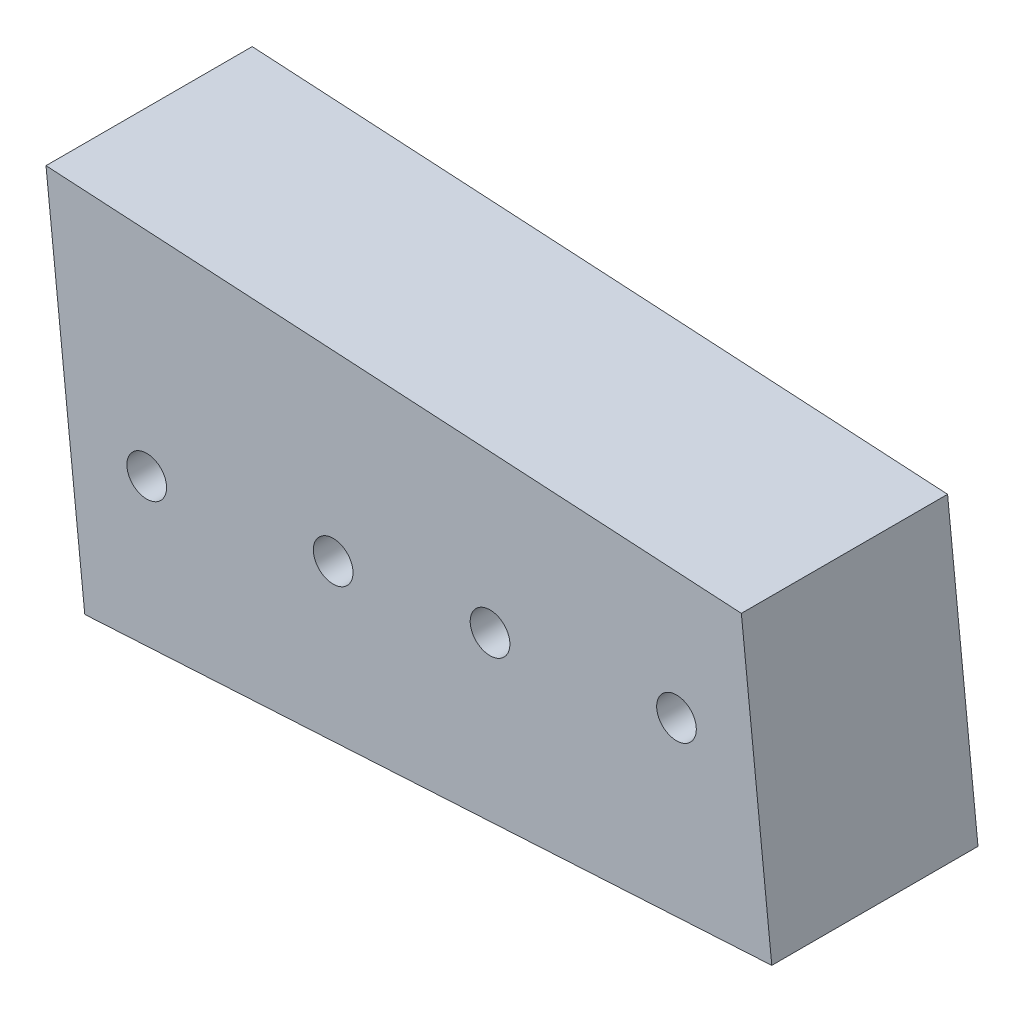
ISO-10303-21;
HEADER;
FILE_DESCRIPTION(('STEP AP214'),'2;1');
FILE_NAME('part.step','',(''),(''),'','','');
FILE_SCHEMA(('AUTOMOTIVE_DESIGN { 1 0 10303 214 1 1 1 1 }'));
ENDSEC;
DATA;
#1=APPLICATION_CONTEXT('core data for automotive mechanical design processes');
#2=APPLICATION_PROTOCOL_DEFINITION('international standard','automotive_design',2000,#1);
#3=PRODUCT_CONTEXT('',#1,'mechanical');
#4=PRODUCT('Part','Part','',(#3));
#5=PRODUCT_RELATED_PRODUCT_CATEGORY('part','',(#4));
#6=PRODUCT_DEFINITION_FORMATION('','',#4);
#7=PRODUCT_DEFINITION_CONTEXT('part definition',#1,'design');
#8=PRODUCT_DEFINITION('design','',#6,#7);
#9=PRODUCT_DEFINITION_SHAPE('','',#8);
#10=(LENGTH_UNIT() NAMED_UNIT(*) SI_UNIT(.MILLI.,.METRE.));
#11=(NAMED_UNIT(*) PLANE_ANGLE_UNIT() SI_UNIT($,.RADIAN.));
#12=(NAMED_UNIT(*) SI_UNIT($,.STERADIAN.) SOLID_ANGLE_UNIT());
#13=UNCERTAINTY_MEASURE_WITH_UNIT(LENGTH_MEASURE(1.E-05),#10,'distance_accuracy_value','');
#14=(GEOMETRIC_REPRESENTATION_CONTEXT(3) GLOBAL_UNCERTAINTY_ASSIGNED_CONTEXT((#13)) GLOBAL_UNIT_ASSIGNED_CONTEXT((#10,
#11,#12)) REPRESENTATION_CONTEXT('',''));
#15=CARTESIAN_POINT('',(0.,0.,0.));
#16=DIRECTION('',(0.,0.,1.));
#17=DIRECTION('',(1.,0.,0.));
#18=AXIS2_PLACEMENT_3D('',#15,#16,#17);
#19=CARTESIAN_POINT('',(73.4186141508776,23.1798241370347,16.5));
#20=DIRECTION('',(-0.99453305601479,-0.104422222222489,0.));
#21=DIRECTION('',(0.104422222222489,-0.99453305601479,0.));
#22=AXIS2_PLACEMENT_3D('',#19,#20,#21);
#23=PLANE('',#22);
#24=DIRECTION('',(-0.104422222222489,0.99453305601479,0.));
#25=VECTOR('',#24,1.);
#26=CARTESIAN_POINT('',(73.4186141508776,23.1798241370347,-16.5));
#27=LINE('',#26,#25);
#28=CARTESIAN_POINT('',(78.2862024778353,-23.1798241370335,-16.5));
#29=VERTEX_POINT('',#28);
#30=CARTESIAN_POINT('',(73.4186141508776,23.1798241370347,-16.5));
#31=VERTEX_POINT('',#30);
#32=EDGE_CURVE('E100',#29,#31,#27,.T.);
#33=ORIENTED_EDGE('',*,*,#32,.T.);
#34=DIRECTION('',(0.,0.,-1.));
#35=VECTOR('',#34,1.);
#36=CARTESIAN_POINT('',(73.4186141508776,23.1798241370347,16.5));
#37=LINE('',#36,#35);
#38=CARTESIAN_POINT('',(73.4186141508776,23.1798241370347,16.5));
#39=VERTEX_POINT('',#38);
#40=EDGE_CURVE('E11',#39,#31,#37,.T.);
#41=ORIENTED_EDGE('',*,*,#40,.F.);
#42=DIRECTION('',(-0.104422222222489,0.99453305601479,0.));
#43=VECTOR('',#42,1.);
#44=CARTESIAN_POINT('',(73.4186141508776,23.1798241370347,16.5));
#45=LINE('',#44,#43);
#46=CARTESIAN_POINT('',(78.2862024778353,-23.1798241370335,16.5));
#47=VERTEX_POINT('',#46);
#48=EDGE_CURVE('E88',#47,#39,#45,.T.);
#49=ORIENTED_EDGE('',*,*,#48,.F.);
#50=DIRECTION('',(0.,0.,-1.));
#51=VECTOR('',#50,1.);
#52=CARTESIAN_POINT('',(78.2862024778353,-23.1798241370335,16.5));
#53=LINE('',#52,#51);
#54=EDGE_CURVE('E96',#47,#29,#53,.T.);
#55=ORIENTED_EDGE('',*,*,#54,.T.);
#56=EDGE_LOOP('',(#33,#41,#49,#55));
#57=FACE_BOUND('',#56,.T.);
#58=ADVANCED_FACE('F37',(#57),#23,.F.);
#59=CARTESIAN_POINT('',(-37.8586436503708,29.5856566483933,16.5));
#60=DIRECTION('',(-0.0574712643678064,-0.998347160947516,0.));
#61=DIRECTION('',(0.998347160947516,-0.0574712643678064,0.));
#62=AXIS2_PLACEMENT_3D('',#59,#60,#61);
#63=PLANE('',#62);
#64=DIRECTION('',(-0.998347160947516,0.0574712643678064,0.));
#65=VECTOR('',#64,1.);
#66=CARTESIAN_POINT('',(-37.8586436503708,29.5856566483933,-16.5));
#67=LINE('',#66,#65);
#68=CARTESIAN_POINT('',(-37.8586436503708,29.5856566483933,-16.5));
#69=VERTEX_POINT('',#68);
#70=EDGE_CURVE('E92',#31,#69,#67,.T.);
#71=ORIENTED_EDGE('',*,*,#70,.T.);
#72=DIRECTION('',(0.,0.,-1.));
#73=VECTOR('',#72,1.);
#74=CARTESIAN_POINT('',(-37.8586436503708,29.5856566483933,16.5));
#75=LINE('',#74,#73);
#76=CARTESIAN_POINT('',(-37.8586436503708,29.5856566483933,16.5));
#77=VERTEX_POINT('',#76);
#78=EDGE_CURVE('E45',#77,#69,#75,.T.);
#79=ORIENTED_EDGE('',*,*,#78,.F.);
#80=DIRECTION('',(-0.998347160947516,0.0574712643678064,0.));
#81=VECTOR('',#80,1.);
#82=CARTESIAN_POINT('',(-37.8586436503708,29.5856566483933,16.5));
#83=LINE('',#82,#81);
#84=EDGE_CURVE('E83',#39,#77,#83,.T.);
#85=ORIENTED_EDGE('',*,*,#84,.F.);
#86=ORIENTED_EDGE('',*,*,#40,.T.);
#87=EDGE_LOOP('',(#71,#79,#85,#86));
#88=FACE_BOUND('',#87,.T.);
#89=ADVANCED_FACE('F91',(#88),#63,.F.);
#90=CARTESIAN_POINT('',(-31.6539605302437,-29.5086848981364,16.5));
#91=DIRECTION('',(0.99453305601479,0.104422222222489,0.));
#92=DIRECTION('',(-0.104422222222489,0.99453305601479,0.));
#93=AXIS2_PLACEMENT_3D('',#90,#91,#92);
#94=PLANE('',#93);
#95=DIRECTION('',(0.104422222222489,-0.99453305601479,0.));
#96=VECTOR('',#95,1.);
#97=CARTESIAN_POINT('',(-31.6539605302437,-29.5086848981364,-16.5));
#98=LINE('',#97,#96);
#99=CARTESIAN_POINT('',(-31.6539605302437,-29.5086848981364,-16.5));
#100=VERTEX_POINT('',#99);
#101=EDGE_CURVE('E70',#69,#100,#98,.T.);
#102=ORIENTED_EDGE('',*,*,#101,.T.);
#103=DIRECTION('',(0.,0.,-1.));
#104=VECTOR('',#103,1.);
#105=CARTESIAN_POINT('',(-31.6539605302437,-29.5086848981364,16.5));
#106=LINE('',#105,#104);
#107=CARTESIAN_POINT('',(-31.6539605302437,-29.5086848981364,16.5));
#108=VERTEX_POINT('',#107);
#109=EDGE_CURVE('E93',#108,#100,#106,.T.);
#110=ORIENTED_EDGE('',*,*,#109,.F.);
#111=DIRECTION('',(0.104422222222489,-0.99453305601479,0.));
#112=VECTOR('',#111,1.);
#113=CARTESIAN_POINT('',(-31.6539605302437,-29.5086848981364,16.5));
#114=LINE('',#113,#112);
#115=EDGE_CURVE('E86',#77,#108,#114,.T.);
#116=ORIENTED_EDGE('',*,*,#115,.F.);
#117=ORIENTED_EDGE('',*,*,#78,.T.);
#118=EDGE_LOOP('',(#102,#110,#116,#117));
#119=FACE_BOUND('',#118,.T.);
#120=ADVANCED_FACE('F94',(#119),#94,.F.);
#121=CARTESIAN_POINT('',(-31.6539605302437,-29.5086848981364,16.5));
#122=DIRECTION('',(-0.0574712643678258,0.998347160947515,0.));
#123=DIRECTION('',(-0.998347160947515,-0.0574712643678258,0.));
#124=AXIS2_PLACEMENT_3D('',#121,#122,#123);
#125=PLANE('',#124);
#126=DIRECTION('',(0.998347160947515,0.0574712643678258,0.));
#127=VECTOR('',#126,1.);
#128=CARTESIAN_POINT('',(-31.6539605302437,-29.5086848981364,-16.5));
#129=LINE('',#128,#127);
#130=EDGE_CURVE('E76',#100,#29,#129,.T.);
#131=ORIENTED_EDGE('',*,*,#130,.T.);
#132=ORIENTED_EDGE('',*,*,#54,.F.);
#133=DIRECTION('',(0.998347160947515,0.0574712643678258,0.));
#134=VECTOR('',#133,1.);
#135=CARTESIAN_POINT('',(-31.6539605302437,-29.5086848981364,16.5));
#136=LINE('',#135,#134);
#137=EDGE_CURVE('E53',#108,#47,#136,.T.);
#138=ORIENTED_EDGE('',*,*,#137,.F.);
#139=ORIENTED_EDGE('',*,*,#109,.T.);
#140=EDGE_LOOP('',(#131,#132,#138,#139));
#141=FACE_BOUND('',#140,.T.);
#142=ADVANCED_FACE('F108',(#141),#125,.F.);
#143=CARTESIAN_POINT('',(0.,0.,16.5));
#144=DIRECTION('',(0.,0.,1.));
#145=DIRECTION('',(1.,0.,0.));
#146=AXIS2_PLACEMENT_3D('',#143,#144,#145);
#147=PLANE('',#146);
#148=CARTESIAN_POINT('',(63.0361498342929,3.50684657977201,16.5));
#149=DIRECTION('',(0.,0.,1.));
#150=DIRECTION('',(1.,0.,0.));
#151=AXIS2_PLACEMENT_3D('',#148,#149,#150);
#152=CIRCLE('',#151,3.17500000000001);
#153=CARTESIAN_POINT('',(66.2111498342929,3.50684657977201,16.5));
#154=VERTEX_POINT('',#153);
#155=EDGE_CURVE('E132',#154,#154,#152,.T.);
#156=ORIENTED_EDGE('',*,*,#155,.F.);
#157=EDGE_LOOP('',(#156));
#158=FACE_BOUND('',#157,.T.);
#159=CARTESIAN_POINT('',(33.2001581538492,0.374179913097574,16.5));
#160=DIRECTION('',(0.,0.,1.));
#161=DIRECTION('',(1.,0.,0.));
#162=AXIS2_PLACEMENT_3D('',#159,#160,#161);
#163=CIRCLE('',#162,3.175);
#164=CARTESIAN_POINT('',(36.3751581538492,0.374179913097574,16.5));
#165=VERTEX_POINT('',#164);
#166=EDGE_CURVE('E129',#165,#165,#163,.T.);
#167=ORIENTED_EDGE('',*,*,#166,.F.);
#168=EDGE_LOOP('',(#167));
#169=FACE_BOUND('',#168,.T.);
#170=CARTESIAN_POINT('',(8.0981438200359,-2.26143697579808,16.5));
#171=DIRECTION('',(0.,0.,1.));
#172=DIRECTION('',(1.,0.,0.));
#173=AXIS2_PLACEMENT_3D('',#170,#171,#172);
#174=CIRCLE('',#173,3.175);
#175=CARTESIAN_POINT('',(11.2731438200359,-2.26143697579808,16.5));
#176=VERTEX_POINT('',#175);
#177=EDGE_CURVE('E123',#176,#176,#174,.T.);
#178=ORIENTED_EDGE('',*,*,#177,.F.);
#179=EDGE_LOOP('',(#178));
#180=FACE_BOUND('',#179,.T.);
#181=CARTESIAN_POINT('',(-21.7378478604078,-5.39410364247252,16.5));
#182=DIRECTION('',(0.,0.,1.));
#183=DIRECTION('',(1.,0.,0.));
#184=AXIS2_PLACEMENT_3D('',#181,#182,#183);
#185=CIRCLE('',#184,3.175);
#186=CARTESIAN_POINT('',(-18.5628478604078,-5.39410364247252,16.5));
#187=VERTEX_POINT('',#186);
#188=EDGE_CURVE('E117',#187,#187,#185,.T.);
#189=ORIENTED_EDGE('',*,*,#188,.F.);
#190=EDGE_LOOP('',(#189));
#191=FACE_BOUND('',#190,.T.);
#192=ORIENTED_EDGE('',*,*,#48,.T.);
#193=ORIENTED_EDGE('',*,*,#84,.T.);
#194=ORIENTED_EDGE('',*,*,#115,.T.);
#195=ORIENTED_EDGE('',*,*,#137,.T.);
#196=EDGE_LOOP('',(#192,#193,#194,#195));
#197=FACE_BOUND('',#196,.T.);
#198=ADVANCED_FACE('F84',(#158,#169,#180,#191,#197),#147,.T.);
#199=CARTESIAN_POINT('',(0.,0.,-16.5));
#200=DIRECTION('',(0.,0.,1.));
#201=DIRECTION('',(1.,0.,0.));
#202=AXIS2_PLACEMENT_3D('',#199,#200,#201);
#203=PLANE('',#202);
#204=CARTESIAN_POINT('',(63.0361498342929,3.50684657977201,-16.5));
#205=DIRECTION('',(0.,0.,1.));
#206=DIRECTION('',(1.,0.,0.));
#207=AXIS2_PLACEMENT_3D('',#204,#205,#206);
#208=CIRCLE('',#207,3.17500000000001);
#209=CARTESIAN_POINT('',(66.2111498342929,3.50684657977201,-16.5));
#210=VERTEX_POINT('',#209);
#211=EDGE_CURVE('E103',#210,#210,#208,.T.);
#212=ORIENTED_EDGE('',*,*,#211,.T.);
#213=EDGE_LOOP('',(#212));
#214=FACE_BOUND('',#213,.T.);
#215=CARTESIAN_POINT('',(33.2001581538492,0.374179913097574,-16.5));
#216=DIRECTION('',(0.,0.,1.));
#217=DIRECTION('',(1.,0.,0.));
#218=AXIS2_PLACEMENT_3D('',#215,#216,#217);
#219=CIRCLE('',#218,3.175);
#220=CARTESIAN_POINT('',(36.3751581538492,0.374179913097574,-16.5));
#221=VERTEX_POINT('',#220);
#222=EDGE_CURVE('E126',#221,#221,#219,.T.);
#223=ORIENTED_EDGE('',*,*,#222,.T.);
#224=EDGE_LOOP('',(#223));
#225=FACE_BOUND('',#224,.T.);
#226=CARTESIAN_POINT('',(8.0981438200359,-2.26143697579808,-16.5));
#227=DIRECTION('',(0.,0.,1.));
#228=DIRECTION('',(1.,0.,0.));
#229=AXIS2_PLACEMENT_3D('',#226,#227,#228);
#230=CIRCLE('',#229,3.175);
#231=CARTESIAN_POINT('',(11.2731438200359,-2.26143697579808,-16.5));
#232=VERTEX_POINT('',#231);
#233=EDGE_CURVE('E120',#232,#232,#230,.T.);
#234=ORIENTED_EDGE('',*,*,#233,.T.);
#235=EDGE_LOOP('',(#234));
#236=FACE_BOUND('',#235,.T.);
#237=CARTESIAN_POINT('',(-21.7378478604078,-5.39410364247252,-16.5));
#238=DIRECTION('',(0.,0.,1.));
#239=DIRECTION('',(1.,0.,0.));
#240=AXIS2_PLACEMENT_3D('',#237,#238,#239);
#241=CIRCLE('',#240,3.175);
#242=CARTESIAN_POINT('',(-18.5628478604078,-5.39410364247252,-16.5));
#243=VERTEX_POINT('',#242);
#244=EDGE_CURVE('E114',#243,#243,#241,.T.);
#245=ORIENTED_EDGE('',*,*,#244,.T.);
#246=EDGE_LOOP('',(#245));
#247=FACE_BOUND('',#246,.T.);
#248=ORIENTED_EDGE('',*,*,#32,.F.);
#249=ORIENTED_EDGE('',*,*,#130,.F.);
#250=ORIENTED_EDGE('',*,*,#101,.F.);
#251=ORIENTED_EDGE('',*,*,#70,.F.);
#252=EDGE_LOOP('',(#248,#249,#250,#251));
#253=FACE_BOUND('',#252,.T.);
#254=ADVANCED_FACE('F111',(#214,#225,#236,#247,#253),#203,.F.);
#255=CARTESIAN_POINT('',(-21.7378478604078,-5.39410364247252,-16.5));
#256=DIRECTION('',(0.,0.,1.));
#257=DIRECTION('',(1.,0.,0.));
#258=AXIS2_PLACEMENT_3D('',#255,#256,#257);
#259=CYLINDRICAL_SURFACE('',#258,3.175);
#260=ORIENTED_EDGE('',*,*,#244,.F.);
#261=EDGE_LOOP('',(#260));
#262=FACE_BOUND('',#261,.T.);
#263=ORIENTED_EDGE('',*,*,#188,.T.);
#264=EDGE_LOOP('',(#263));
#265=FACE_BOUND('',#264,.T.);
#266=ADVANCED_FACE('F156',(#262,#265),#259,.F.);
#267=CARTESIAN_POINT('',(8.0981438200359,-2.26143697579808,-16.5));
#268=DIRECTION('',(0.,0.,1.));
#269=DIRECTION('',(1.,0.,0.));
#270=AXIS2_PLACEMENT_3D('',#267,#268,#269);
#271=CYLINDRICAL_SURFACE('',#270,3.175);
#272=ORIENTED_EDGE('',*,*,#233,.F.);
#273=EDGE_LOOP('',(#272));
#274=FACE_BOUND('',#273,.T.);
#275=ORIENTED_EDGE('',*,*,#177,.T.);
#276=EDGE_LOOP('',(#275));
#277=FACE_BOUND('',#276,.T.);
#278=ADVANCED_FACE('F158',(#274,#277),#271,.F.);
#279=CARTESIAN_POINT('',(33.2001581538492,0.374179913097574,-16.5));
#280=DIRECTION('',(0.,0.,1.));
#281=DIRECTION('',(1.,0.,0.));
#282=AXIS2_PLACEMENT_3D('',#279,#280,#281);
#283=CYLINDRICAL_SURFACE('',#282,3.175);
#284=ORIENTED_EDGE('',*,*,#222,.F.);
#285=EDGE_LOOP('',(#284));
#286=FACE_BOUND('',#285,.T.);
#287=ORIENTED_EDGE('',*,*,#166,.T.);
#288=EDGE_LOOP('',(#287));
#289=FACE_BOUND('',#288,.T.);
#290=ADVANCED_FACE('F143',(#286,#289),#283,.F.);
#291=CARTESIAN_POINT('',(63.0361498342929,3.50684657977201,-16.5));
#292=DIRECTION('',(0.,0.,1.));
#293=DIRECTION('',(1.,0.,0.));
#294=AXIS2_PLACEMENT_3D('',#291,#292,#293);
#295=CYLINDRICAL_SURFACE('',#294,3.17500000000001);
#296=ORIENTED_EDGE('',*,*,#211,.F.);
#297=EDGE_LOOP('',(#296));
#298=FACE_BOUND('',#297,.T.);
#299=ORIENTED_EDGE('',*,*,#155,.T.);
#300=EDGE_LOOP('',(#299));
#301=FACE_BOUND('',#300,.T.);
#302=ADVANCED_FACE('F140',(#298,#301),#295,.F.);
#303=CLOSED_SHELL('',(#58,#89,#120,#142,#198,#254,#266,#278,#290,#302));
#304=MANIFOLD_SOLID_BREP('B2',#303);
#305=ADVANCED_BREP_SHAPE_REPRESENTATION('',(#18,#304),#14);
#306=SHAPE_DEFINITION_REPRESENTATION(#9,#305);
ENDSEC;
END-ISO-10303-21;
